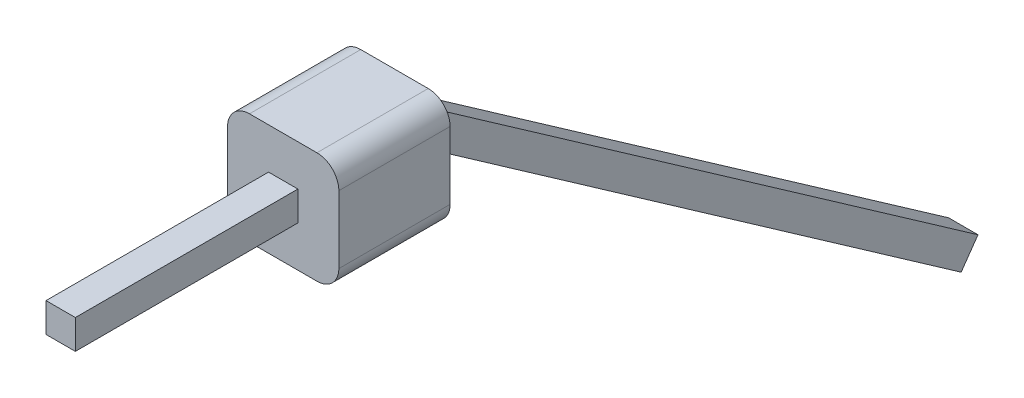
ISO-10303-21;
HEADER;
FILE_DESCRIPTION(('STEP AP214'),'2;1');
FILE_NAME('part.step','',(''),(''),'','','');
FILE_SCHEMA(('AUTOMOTIVE_DESIGN { 1 0 10303 214 1 1 1 1 }'));
ENDSEC;
DATA;
#1=APPLICATION_CONTEXT('core data for automotive mechanical design processes');
#2=APPLICATION_PROTOCOL_DEFINITION('international standard','automotive_design',2000,#1);
#3=PRODUCT_CONTEXT('',#1,'mechanical');
#4=PRODUCT('Part','Part','',(#3));
#5=PRODUCT_RELATED_PRODUCT_CATEGORY('part','',(#4));
#6=PRODUCT_DEFINITION_FORMATION('','',#4);
#7=PRODUCT_DEFINITION_CONTEXT('part definition',#1,'design');
#8=PRODUCT_DEFINITION('design','',#6,#7);
#9=PRODUCT_DEFINITION_SHAPE('','',#8);
#10=(LENGTH_UNIT() NAMED_UNIT(*) SI_UNIT(.MILLI.,.METRE.));
#11=(NAMED_UNIT(*) PLANE_ANGLE_UNIT() SI_UNIT($,.RADIAN.));
#12=(NAMED_UNIT(*) SI_UNIT($,.STERADIAN.) SOLID_ANGLE_UNIT());
#13=UNCERTAINTY_MEASURE_WITH_UNIT(LENGTH_MEASURE(1.E-05),#10,'distance_accuracy_value','');
#14=(GEOMETRIC_REPRESENTATION_CONTEXT(3) GLOBAL_UNCERTAINTY_ASSIGNED_CONTEXT((#13)) GLOBAL_UNIT_ASSIGNED_CONTEXT((#10,
#11,#12)) REPRESENTATION_CONTEXT('',''));
#15=CARTESIAN_POINT('',(0.,0.,0.));
#16=DIRECTION('',(0.,0.,1.));
#17=DIRECTION('',(1.,0.,0.));
#18=AXIS2_PLACEMENT_3D('',#15,#16,#17);
#19=CARTESIAN_POINT('',(-1.27,-0.0190907262086213,2.54));
#20=DIRECTION('',(0.,0.,1.));
#21=DIRECTION('',(1.,0.,0.));
#22=AXIS2_PLACEMENT_3D('',#19,#20,#21);
#23=PLANE('',#22);
#24=DIRECTION('',(1.,0.,0.));
#25=VECTOR('',#24,1.);
#26=CARTESIAN_POINT('',(-1.27,-2.55909072620862,2.54));
#27=LINE('',#26,#25);
#28=CARTESIAN_POINT('',(-0.769999999999999,-2.55909072620862,2.54));
#29=VERTEX_POINT('',#28);
#30=CARTESIAN_POINT('',(0.770000000000001,-2.55909072620862,2.54));
#31=VERTEX_POINT('',#30);
#32=EDGE_CURVE('E247',#29,#31,#27,.T.);
#33=ORIENTED_EDGE('',*,*,#32,.T.);
#34=CARTESIAN_POINT('',(0.770000000000001,-2.05909072620862,2.54));
#35=DIRECTION('',(0.,0.,1.));
#36=DIRECTION('',(1.,0.,0.));
#37=AXIS2_PLACEMENT_3D('',#34,#35,#36);
#38=CIRCLE('',#37,0.5);
#39=CARTESIAN_POINT('',(1.27,-2.05909072620862,2.54));
#40=VERTEX_POINT('',#39);
#41=EDGE_CURVE('E289',#31,#40,#38,.T.);
#42=ORIENTED_EDGE('',*,*,#41,.T.);
#43=DIRECTION('',(0.,1.,0.));
#44=VECTOR('',#43,1.);
#45=CARTESIAN_POINT('',(1.27,-0.019090726208621,2.54));
#46=LINE('',#45,#44);
#47=CARTESIAN_POINT('',(1.27,-0.519090726208621,2.54));
#48=VERTEX_POINT('',#47);
#49=EDGE_CURVE('E250',#40,#48,#46,.T.);
#50=ORIENTED_EDGE('',*,*,#49,.T.);
#51=CARTESIAN_POINT('',(0.770000000000001,-0.519090726208621,2.54));
#52=DIRECTION('',(0.,0.,1.));
#53=DIRECTION('',(1.,0.,0.));
#54=AXIS2_PLACEMENT_3D('',#51,#52,#53);
#55=CIRCLE('',#54,0.5);
#56=CARTESIAN_POINT('',(0.770000000000001,-0.019090726208621,2.54));
#57=VERTEX_POINT('',#56);
#58=EDGE_CURVE('E56',#48,#57,#55,.T.);
#59=ORIENTED_EDGE('',*,*,#58,.T.);
#60=DIRECTION('',(-1.,0.,0.));
#61=VECTOR('',#60,1.);
#62=CARTESIAN_POINT('',(-1.27,-0.0190907262086213,2.54));
#63=LINE('',#62,#61);
#64=CARTESIAN_POINT('',(-0.77,-0.0190907262086212,2.54));
#65=VERTEX_POINT('',#64);
#66=EDGE_CURVE('E252',#57,#65,#63,.T.);
#67=ORIENTED_EDGE('',*,*,#66,.T.);
#68=CARTESIAN_POINT('',(-0.769999999999999,-0.519090726208621,2.54));
#69=DIRECTION('',(0.,0.,1.));
#70=DIRECTION('',(1.,0.,0.));
#71=AXIS2_PLACEMENT_3D('',#68,#69,#70);
#72=CIRCLE('',#71,0.5);
#73=CARTESIAN_POINT('',(-1.27,-0.519090726208621,2.54));
#74=VERTEX_POINT('',#73);
#75=EDGE_CURVE('E285',#65,#74,#72,.T.);
#76=ORIENTED_EDGE('',*,*,#75,.T.);
#77=DIRECTION('',(0.,-1.,0.));
#78=VECTOR('',#77,1.);
#79=CARTESIAN_POINT('',(-1.27,-0.0190907262086213,2.54));
#80=LINE('',#79,#78);
#81=CARTESIAN_POINT('',(-1.27,-2.05909072620862,2.54));
#82=VERTEX_POINT('',#81);
#83=EDGE_CURVE('E244',#74,#82,#80,.T.);
#84=ORIENTED_EDGE('',*,*,#83,.T.);
#85=CARTESIAN_POINT('',(-0.769999999999999,-2.05909072620862,2.54));
#86=DIRECTION('',(0.,0.,1.));
#87=DIRECTION('',(1.,0.,0.));
#88=AXIS2_PLACEMENT_3D('',#85,#86,#87);
#89=CIRCLE('',#88,0.5);
#90=EDGE_CURVE('E287',#82,#29,#89,.T.);
#91=ORIENTED_EDGE('',*,*,#90,.T.);
#92=EDGE_LOOP('',(#33,#42,#50,#59,#67,#76,#84,#91));
#93=FACE_BOUND('',#92,.T.);
#94=DIRECTION('',(0.,1.,0.));
#95=VECTOR('',#94,1.);
#96=CARTESIAN_POINT('',(-0.335,-0.0190907262086213,2.54));
#97=LINE('',#96,#95);
#98=CARTESIAN_POINT('',(-0.335,-1.62409072620862,2.54));
#99=VERTEX_POINT('',#98);
#100=CARTESIAN_POINT('',(-0.335,-0.954090726208621,2.54));
#101=VERTEX_POINT('',#100);
#102=EDGE_CURVE('E227',#99,#101,#97,.T.);
#103=ORIENTED_EDGE('',*,*,#102,.T.);
#104=DIRECTION('',(1.,0.,0.));
#105=VECTOR('',#104,1.);
#106=CARTESIAN_POINT('',(-1.27,-0.95409072620862,2.54));
#107=LINE('',#106,#105);
#108=CARTESIAN_POINT('',(0.335,-0.954090726208621,2.54));
#109=VERTEX_POINT('',#108);
#110=EDGE_CURVE('E230',#101,#109,#107,.T.);
#111=ORIENTED_EDGE('',*,*,#110,.T.);
#112=DIRECTION('',(0.,-1.,0.));
#113=VECTOR('',#112,1.);
#114=CARTESIAN_POINT('',(0.335000000000001,-0.0190907262086233,2.54));
#115=LINE('',#114,#113);
#116=CARTESIAN_POINT('',(0.334999999999999,-1.62409072620862,2.54));
#117=VERTEX_POINT('',#116);
#118=EDGE_CURVE('E223',#109,#117,#115,.T.);
#119=ORIENTED_EDGE('',*,*,#118,.T.);
#120=DIRECTION('',(-1.,0.,0.));
#121=VECTOR('',#120,1.);
#122=CARTESIAN_POINT('',(-1.27,-1.62409072620862,2.54));
#123=LINE('',#122,#121);
#124=EDGE_CURVE('E168',#117,#99,#123,.T.);
#125=ORIENTED_EDGE('',*,*,#124,.T.);
#126=EDGE_LOOP('',(#103,#111,#119,#125));
#127=FACE_BOUND('',#126,.T.);
#128=ADVANCED_FACE('F36',(#93,#127),#23,.T.);
#129=CARTESIAN_POINT('',(-1.27,-0.0190907262086213,0.));
#130=DIRECTION('',(0.,0.,1.));
#131=DIRECTION('',(1.,0.,0.));
#132=AXIS2_PLACEMENT_3D('',#129,#130,#131);
#133=PLANE('',#132);
#134=DIRECTION('',(0.,1.,0.));
#135=VECTOR('',#134,1.);
#136=CARTESIAN_POINT('',(1.27,-0.019090726208621,0.));
#137=LINE('',#136,#135);
#138=CARTESIAN_POINT('',(1.27,-2.05909072620862,0.));
#139=VERTEX_POINT('',#138);
#140=CARTESIAN_POINT('',(1.27,-0.519090726208621,0.));
#141=VERTEX_POINT('',#140);
#142=EDGE_CURVE('E239',#139,#141,#137,.T.);
#143=ORIENTED_EDGE('',*,*,#142,.F.);
#144=CARTESIAN_POINT('',(0.770000000000001,-2.05909072620862,0.));
#145=DIRECTION('',(0.,0.,1.));
#146=DIRECTION('',(1.,0.,0.));
#147=AXIS2_PLACEMENT_3D('',#144,#145,#146);
#148=CIRCLE('',#147,0.5);
#149=CARTESIAN_POINT('',(0.770000000000001,-2.55909072620862,0.));
#150=VERTEX_POINT('',#149);
#151=EDGE_CURVE('E277',#139,#150,#148,.F.);
#152=ORIENTED_EDGE('',*,*,#151,.T.);
#153=DIRECTION('',(1.,0.,0.));
#154=VECTOR('',#153,1.);
#155=CARTESIAN_POINT('',(-1.27,-2.55909072620862,0.));
#156=LINE('',#155,#154);
#157=CARTESIAN_POINT('',(-0.769999999999999,-2.55909072620862,0.));
#158=VERTEX_POINT('',#157);
#159=EDGE_CURVE('E236',#158,#150,#156,.T.);
#160=ORIENTED_EDGE('',*,*,#159,.F.);
#161=CARTESIAN_POINT('',(-0.769999999999999,-2.05909072620862,0.));
#162=DIRECTION('',(0.,0.,1.));
#163=DIRECTION('',(1.,0.,0.));
#164=AXIS2_PLACEMENT_3D('',#161,#162,#163);
#165=CIRCLE('',#164,0.5);
#166=CARTESIAN_POINT('',(-1.27,-2.05909072620862,0.));
#167=VERTEX_POINT('',#166);
#168=EDGE_CURVE('E275',#158,#167,#165,.F.);
#169=ORIENTED_EDGE('',*,*,#168,.T.);
#170=DIRECTION('',(0.,-1.,0.));
#171=VECTOR('',#170,1.);
#172=CARTESIAN_POINT('',(-1.27,-0.0190907262086213,0.));
#173=LINE('',#172,#171);
#174=CARTESIAN_POINT('',(-1.27,-0.519090726208621,0.));
#175=VERTEX_POINT('',#174);
#176=EDGE_CURVE('E233',#175,#167,#173,.T.);
#177=ORIENTED_EDGE('',*,*,#176,.F.);
#178=CARTESIAN_POINT('',(-0.769999999999999,-0.519090726208621,0.));
#179=DIRECTION('',(0.,0.,1.));
#180=DIRECTION('',(1.,0.,0.));
#181=AXIS2_PLACEMENT_3D('',#178,#179,#180);
#182=CIRCLE('',#181,0.5);
#183=CARTESIAN_POINT('',(-0.77,-0.0190907262086212,0.));
#184=VERTEX_POINT('',#183);
#185=EDGE_CURVE('E273',#175,#184,#182,.F.);
#186=ORIENTED_EDGE('',*,*,#185,.T.);
#187=DIRECTION('',(-1.,0.,0.));
#188=VECTOR('',#187,1.);
#189=CARTESIAN_POINT('',(-1.27,-0.0190907262086213,0.));
#190=LINE('',#189,#188);
#191=CARTESIAN_POINT('',(0.770000000000001,-0.019090726208621,0.));
#192=VERTEX_POINT('',#191);
#193=EDGE_CURVE('E242',#192,#184,#190,.T.);
#194=ORIENTED_EDGE('',*,*,#193,.F.);
#195=CARTESIAN_POINT('',(0.770000000000001,-0.519090726208621,0.));
#196=DIRECTION('',(0.,0.,1.));
#197=DIRECTION('',(1.,0.,0.));
#198=AXIS2_PLACEMENT_3D('',#195,#196,#197);
#199=CIRCLE('',#198,0.5);
#200=EDGE_CURVE('E271',#192,#141,#199,.F.);
#201=ORIENTED_EDGE('',*,*,#200,.T.);
#202=EDGE_LOOP('',(#143,#152,#160,#169,#177,#186,#194,#201));
#203=FACE_BOUND('',#202,.T.);
#204=DIRECTION('',(1.,0.,0.));
#205=VECTOR('',#204,1.);
#206=CARTESIAN_POINT('',(-1.27,-0.95409072620862,0.));
#207=LINE('',#206,#205);
#208=CARTESIAN_POINT('',(-0.335,-0.95409072620862,0.));
#209=VERTEX_POINT('',#208);
#210=CARTESIAN_POINT('',(0.335,-0.95409072620862,0.));
#211=VERTEX_POINT('',#210);
#212=EDGE_CURVE('E263',#209,#211,#207,.T.);
#213=ORIENTED_EDGE('',*,*,#212,.F.);
#214=DIRECTION('',(0.,1.,0.));
#215=VECTOR('',#214,1.);
#216=CARTESIAN_POINT('',(-0.335,-0.0190907262086213,0.));
#217=LINE('',#216,#215);
#218=CARTESIAN_POINT('',(-0.335,-1.62409072620862,0.));
#219=VERTEX_POINT('',#218);
#220=EDGE_CURVE('E260',#219,#209,#217,.T.);
#221=ORIENTED_EDGE('',*,*,#220,.F.);
#222=DIRECTION('',(-1.,0.,0.));
#223=VECTOR('',#222,1.);
#224=CARTESIAN_POINT('',(-1.27,-1.62409072620862,0.));
#225=LINE('',#224,#223);
#226=CARTESIAN_POINT('',(0.334999999999999,-1.62409072620862,0.));
#227=VERTEX_POINT('',#226);
#228=EDGE_CURVE('E257',#227,#219,#225,.T.);
#229=ORIENTED_EDGE('',*,*,#228,.F.);
#230=DIRECTION('',(0.,-1.,0.));
#231=VECTOR('',#230,1.);
#232=CARTESIAN_POINT('',(0.335000000000001,-0.0190907262086233,0.));
#233=LINE('',#232,#231);
#234=EDGE_CURVE('E254',#211,#227,#233,.T.);
#235=ORIENTED_EDGE('',*,*,#234,.F.);
#236=EDGE_LOOP('',(#213,#221,#229,#235));
#237=FACE_BOUND('',#236,.T.);
#238=ADVANCED_FACE('F302',(#203,#237),#133,.F.);
#239=CARTESIAN_POINT('',(-1.27,-0.0190907262086213,2.54));
#240=DIRECTION('',(1.,0.,0.));
#241=DIRECTION('',(0.,0.,-1.));
#242=AXIS2_PLACEMENT_3D('',#239,#240,#241);
#243=PLANE('',#242);
#244=ORIENTED_EDGE('',*,*,#176,.T.);
#245=DIRECTION('',(0.,0.,-1.));
#246=VECTOR('',#245,1.);
#247=CARTESIAN_POINT('',(-1.27,-2.05909072620862,2.54));
#248=LINE('',#247,#246);
#249=EDGE_CURVE('E294',#167,#82,#248,.F.);
#250=ORIENTED_EDGE('',*,*,#249,.T.);
#251=ORIENTED_EDGE('',*,*,#83,.F.);
#252=DIRECTION('',(0.,0.,-1.));
#253=VECTOR('',#252,1.);
#254=CARTESIAN_POINT('',(-1.27,-0.519090726208621,2.54));
#255=LINE('',#254,#253);
#256=EDGE_CURVE('E291',#74,#175,#255,.T.);
#257=ORIENTED_EDGE('',*,*,#256,.T.);
#258=EDGE_LOOP('',(#244,#250,#251,#257));
#259=FACE_BOUND('',#258,.T.);
#260=ADVANCED_FACE('F311',(#259),#243,.F.);
#261=CARTESIAN_POINT('',(-1.27,-2.55909072620862,2.54));
#262=DIRECTION('',(0.,1.,0.));
#263=DIRECTION('',(-1.,0.,0.));
#264=AXIS2_PLACEMENT_3D('',#261,#262,#263);
#265=PLANE('',#264);
#266=ORIENTED_EDGE('',*,*,#159,.T.);
#267=DIRECTION('',(0.,0.,-1.));
#268=VECTOR('',#267,1.);
#269=CARTESIAN_POINT('',(0.770000000000001,-2.55909072620862,2.54));
#270=LINE('',#269,#268);
#271=EDGE_CURVE('E282',#150,#31,#270,.F.);
#272=ORIENTED_EDGE('',*,*,#271,.T.);
#273=ORIENTED_EDGE('',*,*,#32,.F.);
#274=DIRECTION('',(0.,0.,-1.));
#275=VECTOR('',#274,1.);
#276=CARTESIAN_POINT('',(-0.769999999999999,-2.55909072620862,2.54));
#277=LINE('',#276,#275);
#278=EDGE_CURVE('E279',#29,#158,#277,.T.);
#279=ORIENTED_EDGE('',*,*,#278,.T.);
#280=EDGE_LOOP('',(#266,#272,#273,#279));
#281=FACE_BOUND('',#280,.T.);
#282=ADVANCED_FACE('F321',(#281),#265,.F.);
#283=CARTESIAN_POINT('',(1.27,-0.019090726208621,2.54));
#284=DIRECTION('',(-1.,0.,0.));
#285=DIRECTION('',(0.,0.,1.));
#286=AXIS2_PLACEMENT_3D('',#283,#284,#285);
#287=PLANE('',#286);
#288=ORIENTED_EDGE('',*,*,#49,.F.);
#289=DIRECTION('',(0.,0.,-1.));
#290=VECTOR('',#289,1.);
#291=CARTESIAN_POINT('',(1.27,-2.05909072620862,2.54));
#292=LINE('',#291,#290);
#293=EDGE_CURVE('E268',#40,#139,#292,.T.);
#294=ORIENTED_EDGE('',*,*,#293,.T.);
#295=ORIENTED_EDGE('',*,*,#142,.T.);
#296=DIRECTION('',(0.,0.,-1.));
#297=VECTOR('',#296,1.);
#298=CARTESIAN_POINT('',(1.27,-0.519090726208621,2.54));
#299=LINE('',#298,#297);
#300=EDGE_CURVE('E266',#141,#48,#299,.F.);
#301=ORIENTED_EDGE('',*,*,#300,.T.);
#302=EDGE_LOOP('',(#288,#294,#295,#301));
#303=FACE_BOUND('',#302,.T.);
#304=ADVANCED_FACE('F329',(#303),#287,.F.);
#305=CARTESIAN_POINT('',(-1.27,-0.0190907262086213,2.54));
#306=DIRECTION('',(0.,-1.,0.));
#307=DIRECTION('',(1.,0.,0.));
#308=AXIS2_PLACEMENT_3D('',#305,#306,#307);
#309=PLANE('',#308);
#310=ORIENTED_EDGE('',*,*,#193,.T.);
#311=DIRECTION('',(0.,0.,-1.));
#312=VECTOR('',#311,1.);
#313=CARTESIAN_POINT('',(-0.77,-0.0190907262086212,2.54));
#314=LINE('',#313,#312);
#315=EDGE_CURVE('E12',#184,#65,#314,.F.);
#316=ORIENTED_EDGE('',*,*,#315,.T.);
#317=ORIENTED_EDGE('',*,*,#66,.F.);
#318=DIRECTION('',(0.,0.,-1.));
#319=VECTOR('',#318,1.);
#320=CARTESIAN_POINT('',(0.770000000000001,-0.019090726208621,2.54));
#321=LINE('',#320,#319);
#322=EDGE_CURVE('E44',#57,#192,#321,.T.);
#323=ORIENTED_EDGE('',*,*,#322,.T.);
#324=EDGE_LOOP('',(#310,#316,#317,#323));
#325=FACE_BOUND('',#324,.T.);
#326=ADVANCED_FACE('F298',(#325),#309,.F.);
#327=CARTESIAN_POINT('',(0.335,-0.95409072620862,-0.60877808216325));
#328=DIRECTION('',(0.,0.819152044288995,-0.573576436351041));
#329=DIRECTION('',(0.,0.573576436351041,0.819152044288995));
#330=AXIS2_PLACEMENT_3D('',#327,#328,#329);
#331=PLANE('',#330);
#332=DIRECTION('',(0.,-0.573576436351041,-0.819152044288995));
#333=VECTOR('',#332,1.);
#334=CARTESIAN_POINT('',(0.335,-0.95409072620862,-0.60877808216325));
#335=LINE('',#334,#333);
#336=CARTESIAN_POINT('',(0.335,-0.95409072620862,-0.60877808216325));
#337=VERTEX_POINT('',#336);
#338=CARTESIAN_POINT('',(0.335,-9.62012981619454,-12.985164534876));
#339=VERTEX_POINT('',#338);
#340=EDGE_CURVE('E216',#337,#339,#335,.T.);
#341=ORIENTED_EDGE('',*,*,#340,.T.);
#342=DIRECTION('',(-1.,0.,0.));
#343=VECTOR('',#342,1.);
#344=CARTESIAN_POINT('',(0.335,-9.62012981619453,-12.985164534876));
#345=LINE('',#344,#343);
#346=CARTESIAN_POINT('',(-0.335,-9.62012981619454,-12.985164534876));
#347=VERTEX_POINT('',#346);
#348=EDGE_CURVE('E222',#339,#347,#345,.T.);
#349=ORIENTED_EDGE('',*,*,#348,.T.);
#350=DIRECTION('',(0.,-0.573576436351041,-0.819152044288995));
#351=VECTOR('',#350,1.);
#352=CARTESIAN_POINT('',(-0.335,-0.95409072620862,-0.60877808216325));
#353=LINE('',#352,#351);
#354=CARTESIAN_POINT('',(-0.335,-0.95409072620862,-0.60877808216325));
#355=VERTEX_POINT('',#354);
#356=EDGE_CURVE('E207',#355,#347,#353,.T.);
#357=ORIENTED_EDGE('',*,*,#356,.F.);
#358=DIRECTION('',(1.,0.,0.));
#359=VECTOR('',#358,1.);
#360=CARTESIAN_POINT('',(0.335,-0.95409072620862,-0.60877808216325));
#361=LINE('',#360,#359);
#362=EDGE_CURVE('E189',#355,#337,#361,.T.);
#363=ORIENTED_EDGE('',*,*,#362,.T.);
#364=EDGE_LOOP('',(#341,#349,#357,#363));
#365=FACE_BOUND('',#364,.T.);
#366=ADVANCED_FACE('F345',(#365),#331,.T.);
#367=CARTESIAN_POINT('',(0.,-9.89454575103135,-12.7930164286984));
#368=DIRECTION('',(0.,-0.573576436351041,-0.819152044288995));
#369=DIRECTION('',(0.,0.819152044288995,-0.573576436351041));
#370=AXIS2_PLACEMENT_3D('',#367,#368,#369);
#371=PLANE('',#370);
#372=DIRECTION('',(0.,0.819152044288995,-0.573576436351041));
#373=VECTOR('',#372,1.);
#374=CARTESIAN_POINT('',(0.335,-9.42234848343921,-13.1236525149885));
#375=LINE('',#374,#373);
#376=CARTESIAN_POINT('',(0.334999999999999,-10.1689616858682,-12.6008683225208));
#377=VERTEX_POINT('',#376);
#378=EDGE_CURVE('E219',#377,#339,#375,.T.);
#379=ORIENTED_EDGE('',*,*,#378,.F.);
#380=DIRECTION('',(1.,0.,0.));
#381=VECTOR('',#380,1.);
#382=CARTESIAN_POINT('',(0.334999999999999,-10.1689616858682,-12.6008683225208));
#383=LINE('',#382,#381);
#384=CARTESIAN_POINT('',(-0.335,-10.1689616858682,-12.6008683225208));
#385=VERTEX_POINT('',#384);
#386=EDGE_CURVE('E225',#385,#377,#383,.T.);
#387=ORIENTED_EDGE('',*,*,#386,.F.);
#388=DIRECTION('',(0.,-0.819152044288995,0.573576436351041));
#389=VECTOR('',#388,1.);
#390=CARTESIAN_POINT('',(-0.335,-9.42234848343921,-13.1236525149885));
#391=LINE('',#390,#389);
#392=EDGE_CURVE('E533',#347,#385,#391,.T.);
#393=ORIENTED_EDGE('',*,*,#392,.F.);
#394=ORIENTED_EDGE('',*,*,#348,.F.);
#395=EDGE_LOOP('',(#379,#387,#393,#394));
#396=FACE_BOUND('',#395,.T.);
#397=ADVANCED_FACE('F469',(#396),#371,.T.);
#398=CARTESIAN_POINT('',(0.334999999999999,-1.62409072620862,-0.397527893614333));
#399=DIRECTION('',(0.,-0.819152044288995,0.573576436351041));
#400=DIRECTION('',(0.,-0.573576436351041,-0.819152044288995));
#401=AXIS2_PLACEMENT_3D('',#398,#399,#400);
#402=PLANE('',#401);
#403=DIRECTION('',(0.,-0.573576436351041,-0.819152044288995));
#404=VECTOR('',#403,1.);
#405=CARTESIAN_POINT('',(-0.335,-1.62409072620862,-0.397527893614333));
#406=LINE('',#405,#404);
#407=CARTESIAN_POINT('',(-0.335,-1.62409072620862,-0.397527893614333));
#408=VERTEX_POINT('',#407);
#409=EDGE_CURVE('E210',#408,#385,#406,.T.);
#410=ORIENTED_EDGE('',*,*,#409,.T.);
#411=ORIENTED_EDGE('',*,*,#386,.T.);
#412=DIRECTION('',(0.,-0.573576436351041,-0.819152044288995));
#413=VECTOR('',#412,1.);
#414=CARTESIAN_POINT('',(0.334999999999999,-1.62409072620862,-0.397527893614333));
#415=LINE('',#414,#413);
#416=CARTESIAN_POINT('',(0.334999999999999,-1.62409072620862,-0.397527893614333));
#417=VERTEX_POINT('',#416);
#418=EDGE_CURVE('E213',#417,#377,#415,.T.);
#419=ORIENTED_EDGE('',*,*,#418,.F.);
#420=DIRECTION('',(-1.,0.,0.));
#421=VECTOR('',#420,1.);
#422=CARTESIAN_POINT('',(0.334999999999999,-1.62409072620862,-0.397527893614333));
#423=LINE('',#422,#421);
#424=EDGE_CURVE('E206',#417,#408,#423,.T.);
#425=ORIENTED_EDGE('',*,*,#424,.T.);
#426=EDGE_LOOP('',(#410,#411,#419,#425));
#427=FACE_BOUND('',#426,.T.);
#428=ADVANCED_FACE('F459',(#427),#402,.T.);
#429=CARTESIAN_POINT('',(0.335,-0.95409072620862,-1.45067607467876));
#430=DIRECTION('',(-1.,0.,0.));
#431=DIRECTION('',(0.,-1.,0.));
#432=AXIS2_PLACEMENT_3D('',#429,#430,#431);
#433=PLANE('',#432);
#434=DIRECTION('',(0.,0.,1.));
#435=VECTOR('',#434,1.);
#436=CARTESIAN_POINT('',(0.335,-0.95409072620862,-1.45067607467876));
#437=LINE('',#436,#435);
#438=EDGE_CURVE('E195',#337,#211,#437,.T.);
#439=ORIENTED_EDGE('',*,*,#438,.T.);
#440=ORIENTED_EDGE('',*,*,#234,.T.);
#441=DIRECTION('',(0.,0.,1.));
#442=VECTOR('',#441,1.);
#443=CARTESIAN_POINT('',(0.334999999999999,-1.62409072620862,-1.45067607467876));
#444=LINE('',#443,#442);
#445=EDGE_CURVE('E172',#417,#227,#444,.T.);
#446=ORIENTED_EDGE('',*,*,#445,.F.);
#447=ORIENTED_EDGE('',*,*,#418,.T.);
#448=ORIENTED_EDGE('',*,*,#378,.T.);
#449=ORIENTED_EDGE('',*,*,#340,.F.);
#450=EDGE_LOOP('',(#439,#440,#446,#447,#448,#449));
#451=FACE_BOUND('',#450,.T.);
#452=ADVANCED_FACE('F392',(#451),#433,.F.);
#453=CARTESIAN_POINT('',(0.334999999999999,-1.62409072620862,-1.45067607467876));
#454=DIRECTION('',(0.,1.,0.));
#455=DIRECTION('',(0.,0.,1.));
#456=AXIS2_PLACEMENT_3D('',#453,#454,#455);
#457=PLANE('',#456);
#458=ORIENTED_EDGE('',*,*,#445,.T.);
#459=ORIENTED_EDGE('',*,*,#228,.T.);
#460=DIRECTION('',(0.,0.,1.));
#461=VECTOR('',#460,1.);
#462=CARTESIAN_POINT('',(-0.335,-1.62409072620862,-1.45067607467876));
#463=LINE('',#462,#461);
#464=EDGE_CURVE('E173',#408,#219,#463,.T.);
#465=ORIENTED_EDGE('',*,*,#464,.F.);
#466=ORIENTED_EDGE('',*,*,#424,.F.);
#467=EDGE_LOOP('',(#458,#459,#465,#466));
#468=FACE_BOUND('',#467,.T.);
#469=ADVANCED_FACE('F404',(#468),#457,.F.);
#470=CARTESIAN_POINT('',(-0.335,-0.95409072620862,-1.45067607467876));
#471=DIRECTION('',(1.,0.,0.));
#472=DIRECTION('',(0.,0.,-1.));
#473=AXIS2_PLACEMENT_3D('',#470,#471,#472);
#474=PLANE('',#473);
#475=ORIENTED_EDGE('',*,*,#464,.T.);
#476=ORIENTED_EDGE('',*,*,#220,.T.);
#477=DIRECTION('',(0.,0.,1.));
#478=VECTOR('',#477,1.);
#479=CARTESIAN_POINT('',(-0.335,-0.95409072620862,-1.45067607467876));
#480=LINE('',#479,#478);
#481=EDGE_CURVE('E199',#355,#209,#480,.T.);
#482=ORIENTED_EDGE('',*,*,#481,.F.);
#483=ORIENTED_EDGE('',*,*,#356,.T.);
#484=ORIENTED_EDGE('',*,*,#392,.T.);
#485=ORIENTED_EDGE('',*,*,#409,.F.);
#486=EDGE_LOOP('',(#475,#476,#482,#483,#484,#485));
#487=FACE_BOUND('',#486,.T.);
#488=ADVANCED_FACE('F415',(#487),#474,.F.);
#489=CARTESIAN_POINT('',(0.335,-0.95409072620862,-1.45067607467876));
#490=DIRECTION('',(0.,-1.,0.));
#491=DIRECTION('',(1.,0.,0.));
#492=AXIS2_PLACEMENT_3D('',#489,#490,#491);
#493=PLANE('',#492);
#494=ORIENTED_EDGE('',*,*,#481,.T.);
#495=ORIENTED_EDGE('',*,*,#212,.T.);
#496=ORIENTED_EDGE('',*,*,#438,.F.);
#497=ORIENTED_EDGE('',*,*,#362,.F.);
#498=EDGE_LOOP('',(#494,#495,#496,#497));
#499=FACE_BOUND('',#498,.T.);
#500=ADVANCED_FACE('F424',(#499),#493,.F.);
#501=ORIENTED_EDGE('',*,*,#110,.F.);
#502=CARTESIAN_POINT('',(-0.335,-0.954090726208621,7.62));
#503=VERTEX_POINT('',#502);
#504=EDGE_CURVE('E198',#101,#503,#480,.T.);
#505=ORIENTED_EDGE('',*,*,#504,.T.);
#506=DIRECTION('',(1.,0.,0.));
#507=VECTOR('',#506,1.);
#508=CARTESIAN_POINT('',(0.335,-0.954090726208622,7.62));
#509=LINE('',#508,#507);
#510=CARTESIAN_POINT('',(0.335,-0.954090726208622,7.62));
#511=VERTEX_POINT('',#510);
#512=EDGE_CURVE('E193',#503,#511,#509,.T.);
#513=ORIENTED_EDGE('',*,*,#512,.T.);
#514=EDGE_CURVE('E185',#109,#511,#437,.T.);
#515=ORIENTED_EDGE('',*,*,#514,.F.);
#516=EDGE_LOOP('',(#501,#505,#513,#515));
#517=FACE_BOUND('',#516,.T.);
#518=ADVANCED_FACE('F412',(#517),#493,.F.);
#519=ORIENTED_EDGE('',*,*,#102,.F.);
#520=CARTESIAN_POINT('',(-0.335,-1.62409072620862,7.62));
#521=VERTEX_POINT('',#520);
#522=EDGE_CURVE('E202',#99,#521,#463,.T.);
#523=ORIENTED_EDGE('',*,*,#522,.T.);
#524=DIRECTION('',(0.,1.,0.));
#525=VECTOR('',#524,1.);
#526=CARTESIAN_POINT('',(-0.335,-0.954090726208621,7.62));
#527=LINE('',#526,#525);
#528=EDGE_CURVE('E181',#521,#503,#527,.T.);
#529=ORIENTED_EDGE('',*,*,#528,.T.);
#530=ORIENTED_EDGE('',*,*,#504,.F.);
#531=EDGE_LOOP('',(#519,#523,#529,#530));
#532=FACE_BOUND('',#531,.T.);
#533=ADVANCED_FACE('F402',(#532),#474,.F.);
#534=ORIENTED_EDGE('',*,*,#124,.F.);
#535=CARTESIAN_POINT('',(0.334999999999999,-1.62409072620862,7.62));
#536=VERTEX_POINT('',#535);
#537=EDGE_CURVE('E161',#117,#536,#444,.T.);
#538=ORIENTED_EDGE('',*,*,#537,.T.);
#539=DIRECTION('',(-1.,0.,0.));
#540=VECTOR('',#539,1.);
#541=CARTESIAN_POINT('',(0.334999999999999,-1.62409072620862,7.62));
#542=LINE('',#541,#540);
#543=EDGE_CURVE('E165',#536,#521,#542,.T.);
#544=ORIENTED_EDGE('',*,*,#543,.T.);
#545=ORIENTED_EDGE('',*,*,#522,.F.);
#546=EDGE_LOOP('',(#534,#538,#544,#545));
#547=FACE_BOUND('',#546,.T.);
#548=ADVANCED_FACE('F163',(#547),#457,.F.);
#549=ORIENTED_EDGE('',*,*,#118,.F.);
#550=ORIENTED_EDGE('',*,*,#514,.T.);
#551=DIRECTION('',(0.,-1.,0.));
#552=VECTOR('',#551,1.);
#553=CARTESIAN_POINT('',(0.335,-0.954090726208622,7.62));
#554=LINE('',#553,#552);
#555=EDGE_CURVE('E179',#511,#536,#554,.T.);
#556=ORIENTED_EDGE('',*,*,#555,.T.);
#557=ORIENTED_EDGE('',*,*,#537,.F.);
#558=EDGE_LOOP('',(#549,#550,#556,#557));
#559=FACE_BOUND('',#558,.T.);
#560=ADVANCED_FACE('F183',(#559),#433,.F.);
#561=CARTESIAN_POINT('',(0.335,-0.954090726208622,7.62));
#562=DIRECTION('',(0.,0.,-1.));
#563=DIRECTION('',(-1.,0.,0.));
#564=AXIS2_PLACEMENT_3D('',#561,#562,#563);
#565=PLANE('',#564);
#566=ORIENTED_EDGE('',*,*,#555,.F.);
#567=ORIENTED_EDGE('',*,*,#512,.F.);
#568=ORIENTED_EDGE('',*,*,#528,.F.);
#569=ORIENTED_EDGE('',*,*,#543,.F.);
#570=EDGE_LOOP('',(#566,#567,#568,#569));
#571=FACE_BOUND('',#570,.T.);
#572=ADVANCED_FACE('F177',(#571),#565,.F.);
#573=CARTESIAN_POINT('',(0.770000000000001,-2.05909072620862,2.54));
#574=DIRECTION('',(0.,0.,-1.));
#575=DIRECTION('',(-1.,0.,0.));
#576=AXIS2_PLACEMENT_3D('',#573,#574,#575);
#577=CYLINDRICAL_SURFACE('',#576,0.5);
#578=ORIENTED_EDGE('',*,*,#41,.F.);
#579=ORIENTED_EDGE('',*,*,#271,.F.);
#580=ORIENTED_EDGE('',*,*,#151,.F.);
#581=ORIENTED_EDGE('',*,*,#293,.F.);
#582=EDGE_LOOP('',(#578,#579,#580,#581));
#583=FACE_BOUND('',#582,.T.);
#584=ADVANCED_FACE('F326',(#583),#577,.T.);
#585=CARTESIAN_POINT('',(-0.769999999999999,-2.05909072620862,2.54));
#586=DIRECTION('',(0.,0.,-1.));
#587=DIRECTION('',(-1.,0.,0.));
#588=AXIS2_PLACEMENT_3D('',#585,#586,#587);
#589=CYLINDRICAL_SURFACE('',#588,0.5);
#590=ORIENTED_EDGE('',*,*,#90,.F.);
#591=ORIENTED_EDGE('',*,*,#249,.F.);
#592=ORIENTED_EDGE('',*,*,#168,.F.);
#593=ORIENTED_EDGE('',*,*,#278,.F.);
#594=EDGE_LOOP('',(#590,#591,#592,#593));
#595=FACE_BOUND('',#594,.T.);
#596=ADVANCED_FACE('F318',(#595),#589,.T.);
#597=CARTESIAN_POINT('',(-0.769999999999999,-0.519090726208621,2.54));
#598=DIRECTION('',(0.,0.,-1.));
#599=DIRECTION('',(-1.,0.,0.));
#600=AXIS2_PLACEMENT_3D('',#597,#598,#599);
#601=CYLINDRICAL_SURFACE('',#600,0.5);
#602=ORIENTED_EDGE('',*,*,#75,.F.);
#603=ORIENTED_EDGE('',*,*,#315,.F.);
#604=ORIENTED_EDGE('',*,*,#185,.F.);
#605=ORIENTED_EDGE('',*,*,#256,.F.);
#606=EDGE_LOOP('',(#602,#603,#604,#605));
#607=FACE_BOUND('',#606,.T.);
#608=ADVANCED_FACE('F308',(#607),#601,.T.);
#609=CARTESIAN_POINT('',(0.770000000000001,-0.519090726208621,2.54));
#610=DIRECTION('',(0.,0.,-1.));
#611=DIRECTION('',(-1.,0.,0.));
#612=AXIS2_PLACEMENT_3D('',#609,#610,#611);
#613=CYLINDRICAL_SURFACE('',#612,0.5);
#614=ORIENTED_EDGE('',*,*,#58,.F.);
#615=ORIENTED_EDGE('',*,*,#300,.F.);
#616=ORIENTED_EDGE('',*,*,#200,.F.);
#617=ORIENTED_EDGE('',*,*,#322,.F.);
#618=EDGE_LOOP('',(#614,#615,#616,#617));
#619=FACE_BOUND('',#618,.T.);
#620=ADVANCED_FACE('F38',(#619),#613,.T.);
#621=CLOSED_SHELL('',(#128,#238,#260,#282,#304,#326,#366,#397,#428,#452,#469,#488,#500,#518,
#533,#548,#560,#572,#584,#596,#608,#620));
#622=MANIFOLD_SOLID_BREP('B2',#621);
#623=ADVANCED_BREP_SHAPE_REPRESENTATION('',(#18,#622),#14);
#624=SHAPE_DEFINITION_REPRESENTATION(#9,#623);
ENDSEC;
END-ISO-10303-21;
